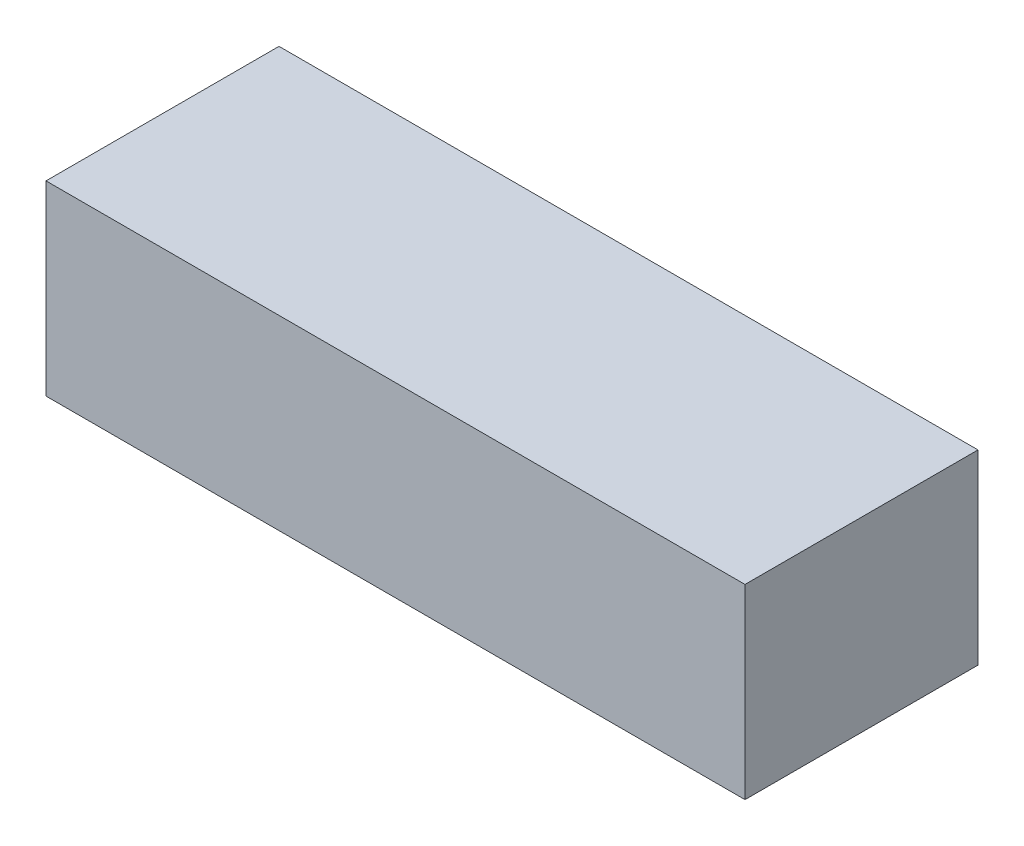
ISO-10303-21;
HEADER;
FILE_DESCRIPTION(('STEP AP214'),'2;1');
FILE_NAME('part.step','',(''),(''),'','','');
FILE_SCHEMA(('AUTOMOTIVE_DESIGN { 1 0 10303 214 1 1 1 1 }'));
ENDSEC;
DATA;
#1=APPLICATION_CONTEXT('core data for automotive mechanical design processes');
#2=APPLICATION_PROTOCOL_DEFINITION('international standard','automotive_design',2000,#1);
#3=PRODUCT_CONTEXT('',#1,'mechanical');
#4=PRODUCT('Part','Part','',(#3));
#5=PRODUCT_RELATED_PRODUCT_CATEGORY('part','',(#4));
#6=PRODUCT_DEFINITION_FORMATION('','',#4);
#7=PRODUCT_DEFINITION_CONTEXT('part definition',#1,'design');
#8=PRODUCT_DEFINITION('design','',#6,#7);
#9=PRODUCT_DEFINITION_SHAPE('','',#8);
#10=(LENGTH_UNIT() NAMED_UNIT(*) SI_UNIT(.MILLI.,.METRE.));
#11=(NAMED_UNIT(*) PLANE_ANGLE_UNIT() SI_UNIT($,.RADIAN.));
#12=(NAMED_UNIT(*) SI_UNIT($,.STERADIAN.) SOLID_ANGLE_UNIT());
#13=UNCERTAINTY_MEASURE_WITH_UNIT(LENGTH_MEASURE(1.E-05),#10,'distance_accuracy_value','');
#14=(GEOMETRIC_REPRESENTATION_CONTEXT(3) GLOBAL_UNCERTAINTY_ASSIGNED_CONTEXT((#13)) GLOBAL_UNIT_ASSIGNED_CONTEXT((#10,
#11,#12)) REPRESENTATION_CONTEXT('',''));
#15=CARTESIAN_POINT('',(0.,0.,0.));
#16=DIRECTION('',(0.,0.,1.));
#17=DIRECTION('',(1.,0.,0.));
#18=AXIS2_PLACEMENT_3D('',#15,#16,#17);
#19=CARTESIAN_POINT('',(-38.1,20.32,12.7));
#20=DIRECTION('',(1.,0.,0.));
#21=DIRECTION('',(0.,0.,-1.));
#22=AXIS2_PLACEMENT_3D('',#19,#20,#21);
#23=PLANE('',#22);
#24=DIRECTION('',(0.,0.,1.));
#25=VECTOR('',#24,1.);
#26=CARTESIAN_POINT('',(-38.1,0.,12.7));
#27=LINE('',#26,#25);
#28=CARTESIAN_POINT('',(-38.1,0.,-12.7));
#29=VERTEX_POINT('',#28);
#30=CARTESIAN_POINT('',(-38.1,0.,12.7));
#31=VERTEX_POINT('',#30);
#32=EDGE_CURVE('E111',#29,#31,#27,.T.);
#33=ORIENTED_EDGE('',*,*,#32,.T.);
#34=DIRECTION('',(0.,-1.,0.));
#35=VECTOR('',#34,1.);
#36=CARTESIAN_POINT('',(-38.1,20.32,12.7));
#37=LINE('',#36,#35);
#38=CARTESIAN_POINT('',(-38.1,20.32,12.7));
#39=VERTEX_POINT('',#38);
#40=EDGE_CURVE('E11',#39,#31,#37,.T.);
#41=ORIENTED_EDGE('',*,*,#40,.F.);
#42=DIRECTION('',(0.,0.,1.));
#43=VECTOR('',#42,1.);
#44=CARTESIAN_POINT('',(-38.1,20.32,12.7));
#45=LINE('',#44,#43);
#46=CARTESIAN_POINT('',(-38.1,20.32,-12.7));
#47=VERTEX_POINT('',#46);
#48=EDGE_CURVE('E95',#47,#39,#45,.T.);
#49=ORIENTED_EDGE('',*,*,#48,.F.);
#50=DIRECTION('',(0.,-1.,0.));
#51=VECTOR('',#50,1.);
#52=CARTESIAN_POINT('',(-38.1,20.32,-12.7));
#53=LINE('',#52,#51);
#54=EDGE_CURVE('E107',#47,#29,#53,.T.);
#55=ORIENTED_EDGE('',*,*,#54,.T.);
#56=EDGE_LOOP('',(#33,#41,#49,#55));
#57=FACE_BOUND('',#56,.T.);
#58=ADVANCED_FACE('F43',(#57),#23,.F.);
#59=CARTESIAN_POINT('',(38.1,20.32,12.7));
#60=DIRECTION('',(0.,0.,-1.));
#61=DIRECTION('',(-1.,0.,0.));
#62=AXIS2_PLACEMENT_3D('',#59,#60,#61);
#63=PLANE('',#62);
#64=DIRECTION('',(1.,0.,0.));
#65=VECTOR('',#64,1.);
#66=CARTESIAN_POINT('',(38.1,0.,12.7));
#67=LINE('',#66,#65);
#68=CARTESIAN_POINT('',(38.1,0.,12.7));
#69=VERTEX_POINT('',#68);
#70=EDGE_CURVE('E100',#31,#69,#67,.T.);
#71=ORIENTED_EDGE('',*,*,#70,.T.);
#72=DIRECTION('',(0.,-1.,0.));
#73=VECTOR('',#72,1.);
#74=CARTESIAN_POINT('',(38.1,20.32,12.7));
#75=LINE('',#74,#73);
#76=CARTESIAN_POINT('',(38.1,20.32,12.7));
#77=VERTEX_POINT('',#76);
#78=EDGE_CURVE('E52',#77,#69,#75,.T.);
#79=ORIENTED_EDGE('',*,*,#78,.F.);
#80=DIRECTION('',(1.,0.,0.));
#81=VECTOR('',#80,1.);
#82=CARTESIAN_POINT('',(38.1,20.32,12.7));
#83=LINE('',#82,#81);
#84=EDGE_CURVE('E90',#39,#77,#83,.T.);
#85=ORIENTED_EDGE('',*,*,#84,.F.);
#86=ORIENTED_EDGE('',*,*,#40,.T.);
#87=EDGE_LOOP('',(#71,#79,#85,#86));
#88=FACE_BOUND('',#87,.T.);
#89=ADVANCED_FACE('F99',(#88),#63,.F.);
#90=CARTESIAN_POINT('',(38.1,20.32,12.7));
#91=DIRECTION('',(-1.,0.,0.));
#92=DIRECTION('',(0.,0.,1.));
#93=AXIS2_PLACEMENT_3D('',#90,#91,#92);
#94=PLANE('',#93);
#95=DIRECTION('',(0.,0.,-1.));
#96=VECTOR('',#95,1.);
#97=CARTESIAN_POINT('',(38.1,0.,12.7));
#98=LINE('',#97,#96);
#99=CARTESIAN_POINT('',(38.1,0.,-12.7));
#100=VERTEX_POINT('',#99);
#101=EDGE_CURVE('E77',#69,#100,#98,.T.);
#102=ORIENTED_EDGE('',*,*,#101,.T.);
#103=DIRECTION('',(0.,-1.,0.));
#104=VECTOR('',#103,1.);
#105=CARTESIAN_POINT('',(38.1,20.32,-12.7));
#106=LINE('',#105,#104);
#107=CARTESIAN_POINT('',(38.1,20.32,-12.7));
#108=VERTEX_POINT('',#107);
#109=EDGE_CURVE('E102',#108,#100,#106,.T.);
#110=ORIENTED_EDGE('',*,*,#109,.F.);
#111=DIRECTION('',(0.,0.,-1.));
#112=VECTOR('',#111,1.);
#113=CARTESIAN_POINT('',(38.1,20.32,12.7));
#114=LINE('',#113,#112);
#115=EDGE_CURVE('E93',#77,#108,#114,.T.);
#116=ORIENTED_EDGE('',*,*,#115,.F.);
#117=ORIENTED_EDGE('',*,*,#78,.T.);
#118=EDGE_LOOP('',(#102,#110,#116,#117));
#119=FACE_BOUND('',#118,.T.);
#120=ADVANCED_FACE('F103',(#119),#94,.F.);
#121=CARTESIAN_POINT('',(38.1,20.32,-12.7));
#122=DIRECTION('',(0.,0.,1.));
#123=DIRECTION('',(1.,0.,0.));
#124=AXIS2_PLACEMENT_3D('',#121,#122,#123);
#125=PLANE('',#124);
#126=DIRECTION('',(-1.,0.,0.));
#127=VECTOR('',#126,1.);
#128=CARTESIAN_POINT('',(38.1,0.,-12.7));
#129=LINE('',#128,#127);
#130=EDGE_CURVE('E83',#100,#29,#129,.T.);
#131=ORIENTED_EDGE('',*,*,#130,.T.);
#132=ORIENTED_EDGE('',*,*,#54,.F.);
#133=DIRECTION('',(-1.,0.,0.));
#134=VECTOR('',#133,1.);
#135=CARTESIAN_POINT('',(38.1,20.32,-12.7));
#136=LINE('',#135,#134);
#137=EDGE_CURVE('E60',#108,#47,#136,.T.);
#138=ORIENTED_EDGE('',*,*,#137,.F.);
#139=ORIENTED_EDGE('',*,*,#109,.T.);
#140=EDGE_LOOP('',(#131,#132,#138,#139));
#141=FACE_BOUND('',#140,.T.);
#142=ADVANCED_FACE('F124',(#141),#125,.F.);
#143=CARTESIAN_POINT('',(0.,20.32,0.));
#144=DIRECTION('',(0.,1.,0.));
#145=DIRECTION('',(0.,0.,1.));
#146=AXIS2_PLACEMENT_3D('',#143,#144,#145);
#147=PLANE('',#146);
#148=ORIENTED_EDGE('',*,*,#48,.T.);
#149=ORIENTED_EDGE('',*,*,#84,.T.);
#150=ORIENTED_EDGE('',*,*,#115,.T.);
#151=ORIENTED_EDGE('',*,*,#137,.T.);
#152=EDGE_LOOP('',(#148,#149,#150,#151));
#153=FACE_BOUND('',#152,.T.);
#154=ADVANCED_FACE('F91',(#153),#147,.T.);
#155=CARTESIAN_POINT('',(0.,0.,0.));
#156=DIRECTION('',(0.,1.,0.));
#157=DIRECTION('',(0.,0.,1.));
#158=AXIS2_PLACEMENT_3D('',#155,#156,#157);
#159=PLANE('',#158);
#160=ORIENTED_EDGE('',*,*,#32,.F.);
#161=ORIENTED_EDGE('',*,*,#130,.F.);
#162=ORIENTED_EDGE('',*,*,#101,.F.);
#163=ORIENTED_EDGE('',*,*,#70,.F.);
#164=EDGE_LOOP('',(#160,#161,#162,#163));
#165=FACE_BOUND('',#164,.T.);
#166=ADVANCED_FACE('F127',(#165),#159,.F.);
#167=CLOSED_SHELL('',(#58,#89,#120,#142,#154,#166));
#168=MANIFOLD_SOLID_BREP('B2',#167);
#169=ADVANCED_BREP_SHAPE_REPRESENTATION('',(#18,#168),#14);
#170=SHAPE_DEFINITION_REPRESENTATION(#9,#169);
ENDSEC;
END-ISO-10303-21;
